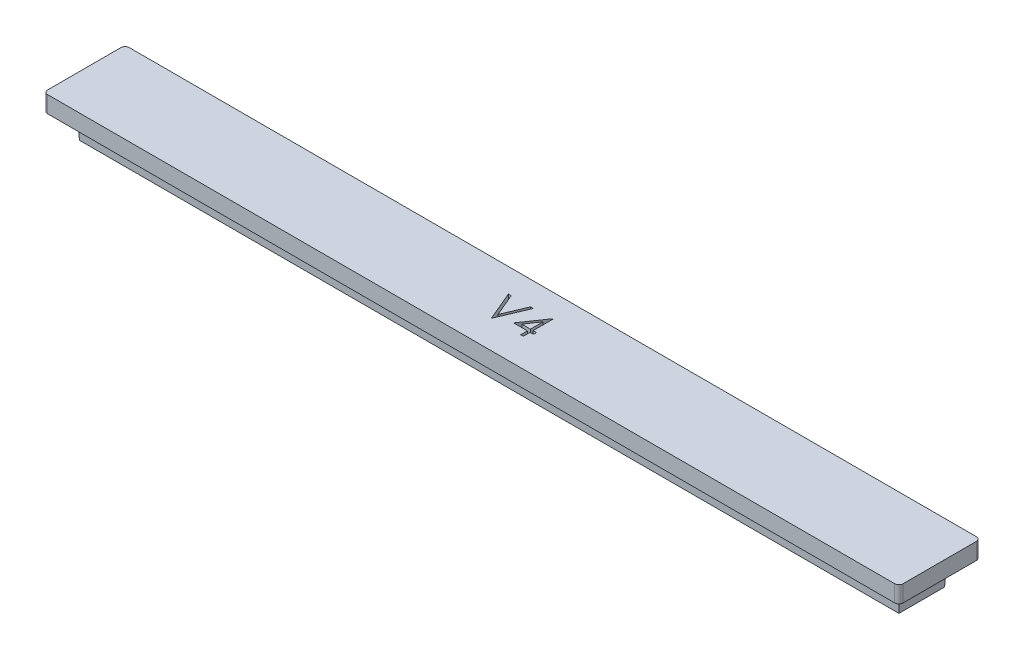
ISO-10303-21;
HEADER;
FILE_DESCRIPTION(('STEP AP214'),'2;1');
FILE_NAME('part.step','',(''),(''),'','','');
FILE_SCHEMA(('AUTOMOTIVE_DESIGN { 1 0 10303 214 1 1 1 1 }'));
ENDSEC;
DATA;
#1=APPLICATION_CONTEXT('core data for automotive mechanical design processes');
#2=APPLICATION_PROTOCOL_DEFINITION('international standard','automotive_design',2000,#1);
#3=PRODUCT_CONTEXT('',#1,'mechanical');
#4=PRODUCT('Part','Part','',(#3));
#5=PRODUCT_RELATED_PRODUCT_CATEGORY('part','',(#4));
#6=PRODUCT_DEFINITION_FORMATION('','',#4);
#7=PRODUCT_DEFINITION_CONTEXT('part definition',#1,'design');
#8=PRODUCT_DEFINITION('design','',#6,#7);
#9=PRODUCT_DEFINITION_SHAPE('','',#8);
#10=(LENGTH_UNIT() NAMED_UNIT(*) SI_UNIT(.MILLI.,.METRE.));
#11=(NAMED_UNIT(*) PLANE_ANGLE_UNIT() SI_UNIT($,.RADIAN.));
#12=(NAMED_UNIT(*) SI_UNIT($,.STERADIAN.) SOLID_ANGLE_UNIT());
#13=UNCERTAINTY_MEASURE_WITH_UNIT(LENGTH_MEASURE(1.E-05),#10,'distance_accuracy_value','');
#14=(GEOMETRIC_REPRESENTATION_CONTEXT(3) GLOBAL_UNCERTAINTY_ASSIGNED_CONTEXT((#13)) GLOBAL_UNIT_ASSIGNED_CONTEXT((#10,
#11,#12)) REPRESENTATION_CONTEXT('',''));
#15=CARTESIAN_POINT('',(0.,0.,0.));
#16=DIRECTION('',(0.,0.,1.));
#17=DIRECTION('',(1.,0.,0.));
#18=AXIS2_PLACEMENT_3D('',#15,#16,#17);
#19=CARTESIAN_POINT('',(0.,5.,0.));
#20=DIRECTION('',(0.,1.,0.));
#21=DIRECTION('',(0.,0.,1.));
#22=AXIS2_PLACEMENT_3D('',#19,#20,#21);
#23=PLANE('',#22);
#24=DIRECTION('',(-1.,0.,0.));
#25=VECTOR('',#24,1.);
#26=CARTESIAN_POINT('',(51.4,5.,-4.9));
#27=LINE('',#26,#25);
#28=CARTESIAN_POINT('',(50.9,5.,-4.9));
#29=VERTEX_POINT('',#28);
#30=CARTESIAN_POINT('',(-50.9,5.,-4.89999999999998));
#31=VERTEX_POINT('',#30);
#32=EDGE_CURVE('E426',#29,#31,#27,.T.);
#33=ORIENTED_EDGE('',*,*,#32,.T.);
#34=CARTESIAN_POINT('',(-50.9,5.,-4.39999999999998));
#35=DIRECTION('',(0.,1.,0.));
#36=DIRECTION('',(0.,0.,1.));
#37=AXIS2_PLACEMENT_3D('',#34,#35,#36);
#38=CIRCLE('',#37,0.5);
#39=CARTESIAN_POINT('',(-51.4,5.,-4.39999999999998));
#40=VERTEX_POINT('',#39);
#41=EDGE_CURVE('E509',#31,#40,#38,.T.);
#42=ORIENTED_EDGE('',*,*,#41,.T.);
#43=DIRECTION('',(0.,0.,1.));
#44=VECTOR('',#43,1.);
#45=CARTESIAN_POINT('',(-51.4,5.,-4.89999999999998));
#46=LINE('',#45,#44);
#47=CARTESIAN_POINT('',(-51.4,5.,4.4));
#48=VERTEX_POINT('',#47);
#49=EDGE_CURVE('E276',#40,#48,#46,.T.);
#50=ORIENTED_EDGE('',*,*,#49,.T.);
#51=CARTESIAN_POINT('',(-50.9,5.,4.4));
#52=DIRECTION('',(0.,1.,0.));
#53=DIRECTION('',(0.,0.,1.));
#54=AXIS2_PLACEMENT_3D('',#51,#52,#53);
#55=CIRCLE('',#54,0.5);
#56=CARTESIAN_POINT('',(-50.9,5.,4.9));
#57=VERTEX_POINT('',#56);
#58=EDGE_CURVE('E500',#48,#57,#55,.T.);
#59=ORIENTED_EDGE('',*,*,#58,.T.);
#60=DIRECTION('',(1.,0.,0.));
#61=VECTOR('',#60,1.);
#62=CARTESIAN_POINT('',(-51.4,5.,4.9));
#63=LINE('',#62,#61);
#64=CARTESIAN_POINT('',(50.9,5.,4.9));
#65=VERTEX_POINT('',#64);
#66=EDGE_CURVE('E282',#57,#65,#63,.T.);
#67=ORIENTED_EDGE('',*,*,#66,.T.);
#68=CARTESIAN_POINT('',(50.9,5.,4.4));
#69=DIRECTION('',(0.,1.,0.));
#70=DIRECTION('',(0.,0.,1.));
#71=AXIS2_PLACEMENT_3D('',#68,#69,#70);
#72=CIRCLE('',#71,0.5);
#73=CARTESIAN_POINT('',(51.4,5.,4.4));
#74=VERTEX_POINT('',#73);
#75=EDGE_CURVE('E503',#65,#74,#72,.T.);
#76=ORIENTED_EDGE('',*,*,#75,.T.);
#77=DIRECTION('',(0.,0.,-1.));
#78=VECTOR('',#77,1.);
#79=CARTESIAN_POINT('',(51.4,5.,4.9));
#80=LINE('',#79,#78);
#81=CARTESIAN_POINT('',(51.4,5.,-4.4));
#82=VERTEX_POINT('',#81);
#83=EDGE_CURVE('E442',#74,#82,#80,.T.);
#84=ORIENTED_EDGE('',*,*,#83,.T.);
#85=CARTESIAN_POINT('',(50.9,5.,-4.4));
#86=DIRECTION('',(0.,1.,0.));
#87=DIRECTION('',(0.,0.,1.));
#88=AXIS2_PLACEMENT_3D('',#85,#86,#87);
#89=CIRCLE('',#88,0.5);
#90=EDGE_CURVE('E506',#82,#29,#89,.T.);
#91=ORIENTED_EDGE('',*,*,#90,.T.);
#92=EDGE_LOOP('',(#33,#42,#50,#59,#67,#76,#84,#91));
#93=FACE_BOUND('',#92,.T.);
#94=DIRECTION('',(-1.,0.,0.));
#95=VECTOR('',#94,1.);
#96=CARTESIAN_POINT('',(2.51443006220043,5.,0.658238506771151));
#97=LINE('',#96,#95);
#98=CARTESIAN_POINT('',(2.51443006220043,5.,0.658238506771151));
#99=VERTEX_POINT('',#98);
#100=CARTESIAN_POINT('',(0.854173651944023,5.,0.658238506771151));
#101=VERTEX_POINT('',#100);
#102=EDGE_CURVE('E327',#99,#101,#97,.T.);
#103=ORIENTED_EDGE('',*,*,#102,.T.);
#104=DIRECTION('',(0.566105543193208,0.,-0.824332768950697));
#105=VECTOR('',#104,1.);
#106=CARTESIAN_POINT('',(0.854173651944023,5.,0.658238506771151));
#107=LINE('',#106,#105);
#108=CARTESIAN_POINT('',(2.76473054296966,5.,-2.12381277528013));
#109=VERTEX_POINT('',#108);
#110=EDGE_CURVE('E64',#101,#109,#107,.T.);
#111=ORIENTED_EDGE('',*,*,#110,.T.);
#112=DIRECTION('',(1.,0.,0.));
#113=VECTOR('',#112,1.);
#114=CARTESIAN_POINT('',(2.76473054296966,5.,-2.12381277528013));
#115=LINE('',#114,#113);
#116=CARTESIAN_POINT('',(2.828532626303,5.,-2.12381277528013));
#117=VERTEX_POINT('',#116);
#118=EDGE_CURVE('E357',#109,#117,#115,.T.);
#119=ORIENTED_EDGE('',*,*,#118,.T.);
#120=DIRECTION('',(0.,0.,1.));
#121=VECTOR('',#120,1.);
#122=CARTESIAN_POINT('',(2.828532626303,5.,-2.12381277528013));
#123=LINE('',#122,#121);
#124=CARTESIAN_POINT('',(2.828532626303,5.,0.299264147796792));
#125=VERTEX_POINT('',#124);
#126=EDGE_CURVE('E361',#117,#125,#123,.T.);
#127=ORIENTED_EDGE('',*,*,#126,.T.);
#128=DIRECTION('',(1.,0.,0.));
#129=VECTOR('',#128,1.);
#130=CARTESIAN_POINT('',(2.828532626303,5.,0.299264147796792));
#131=LINE('',#130,#129);
#132=CARTESIAN_POINT('',(3.23237878014915,5.,0.299264147796792));
#133=VERTEX_POINT('',#132);
#134=EDGE_CURVE('E365',#125,#133,#131,.T.);
#135=ORIENTED_EDGE('',*,*,#134,.T.);
#136=DIRECTION('',(0.,0.,1.));
#137=VECTOR('',#136,1.);
#138=CARTESIAN_POINT('',(3.23237878014915,5.,0.299264147796792));
#139=LINE('',#138,#137);
#140=CARTESIAN_POINT('',(3.23237878014915,5.,0.658238506771151));
#141=VERTEX_POINT('',#140);
#142=EDGE_CURVE('E369',#133,#141,#139,.T.);
#143=ORIENTED_EDGE('',*,*,#142,.T.);
#144=DIRECTION('',(-1.,0.,0.));
#145=VECTOR('',#144,1.);
#146=CARTESIAN_POINT('',(3.23237878014915,5.,0.658238506771151));
#147=LINE('',#146,#145);
#148=CARTESIAN_POINT('',(2.828532626303,5.,0.658238506771151));
#149=VERTEX_POINT('',#148);
#150=EDGE_CURVE('E373',#141,#149,#147,.T.);
#151=ORIENTED_EDGE('',*,*,#150,.T.);
#152=DIRECTION('',(0.,0.,1.));
#153=VECTOR('',#152,1.);
#154=CARTESIAN_POINT('',(2.828532626303,5.,0.658238506771151));
#155=LINE('',#154,#153);
#156=CARTESIAN_POINT('',(2.828532626303,5.,1.46593081446346));
#157=VERTEX_POINT('',#156);
#158=EDGE_CURVE('E377',#149,#157,#155,.T.);
#159=ORIENTED_EDGE('',*,*,#158,.T.);
#160=DIRECTION('',(-1.,0.,0.));
#161=VECTOR('',#160,1.);
#162=CARTESIAN_POINT('',(2.828532626303,5.,1.46593081446346));
#163=LINE('',#162,#161);
#164=CARTESIAN_POINT('',(2.51443006220043,5.,1.46593081446346));
#165=VERTEX_POINT('',#164);
#166=EDGE_CURVE('E381',#157,#165,#163,.T.);
#167=ORIENTED_EDGE('',*,*,#166,.T.);
#168=DIRECTION('',(0.,0.,-1.));
#169=VECTOR('',#168,1.);
#170=CARTESIAN_POINT('',(2.51443006220043,5.,1.46593081446346));
#171=LINE('',#170,#169);
#172=EDGE_CURVE('E385',#165,#99,#171,.T.);
#173=ORIENTED_EDGE('',*,*,#172,.T.);
#174=EDGE_LOOP('',(#103,#111,#119,#127,#135,#143,#151,#159,#167,#173));
#175=FACE_BOUND('',#174,.T.);
#176=DIRECTION('',(-1.,0.,0.));
#177=VECTOR('',#176,1.);
#178=CARTESIAN_POINT('',(-0.940698142927772,5.,1.46593081446346));
#179=LINE('',#178,#177);
#180=CARTESIAN_POINT('',(-0.940698142927772,5.,1.46593081446346));
#181=VERTEX_POINT('',#180);
#182=CARTESIAN_POINT('',(-0.985569937799566,5.,1.46593081446346));
#183=VERTEX_POINT('',#182);
#184=EDGE_CURVE('E270',#181,#183,#179,.T.);
#185=ORIENTED_EDGE('',*,*,#184,.T.);
#186=DIRECTION('',(-0.389639990836698,0.,-0.920967251068559));
#187=VECTOR('',#186,1.);
#188=CARTESIAN_POINT('',(-0.985569937799566,5.,1.46593081446346));
#189=LINE('',#188,#187);
#190=CARTESIAN_POINT('',(-2.4663391685688,5.,-2.03406918553654));
#191=VERTEX_POINT('',#190);
#192=EDGE_CURVE('E56',#183,#191,#189,.T.);
#193=ORIENTED_EDGE('',*,*,#192,.T.);
#194=DIRECTION('',(1.,0.,0.));
#195=VECTOR('',#194,1.);
#196=CARTESIAN_POINT('',(-2.4663391685688,5.,-2.03406918553654));
#197=LINE('',#196,#195);
#198=CARTESIAN_POINT('',(-2.12980070703034,5.,-2.03406918553654));
#199=VERTEX_POINT('',#198);
#200=EDGE_CURVE('E274',#191,#199,#197,.T.);
#201=ORIENTED_EDGE('',*,*,#200,.T.);
#202=DIRECTION('',(0.389563616454194,0.,0.920999559573798));
#203=VECTOR('',#202,1.);
#204=CARTESIAN_POINT('',(-2.12980070703034,5.,-2.03406918553654));
#205=LINE('',#204,#203);
#206=CARTESIAN_POINT('',(-0.963134040363669,5.,0.7241439554891));
#207=VERTEX_POINT('',#206);
#208=EDGE_CURVE('E921',#199,#207,#205,.T.);
#209=ORIENTED_EDGE('',*,*,#208,.T.);
#210=DIRECTION('',(0.389563616454194,0.,-0.920999559573798));
#211=VECTOR('',#210,1.);
#212=CARTESIAN_POINT('',(-0.963134040363669,5.,0.7241439554891));
#213=LINE('',#212,#211);
#214=CARTESIAN_POINT('',(0.203532626302998,5.,-2.03406918553654));
#215=VERTEX_POINT('',#214);
#216=EDGE_CURVE('E902',#207,#215,#213,.T.);
#217=ORIENTED_EDGE('',*,*,#216,.T.);
#218=DIRECTION('',(1.,0.,0.));
#219=VECTOR('',#218,1.);
#220=CARTESIAN_POINT('',(0.203532626302998,5.,-2.03406918553654));
#221=LINE('',#220,#219);
#222=CARTESIAN_POINT('',(0.540071087841459,5.,-2.03406918553654));
#223=VERTEX_POINT('',#222);
#224=EDGE_CURVE('E897',#215,#223,#221,.T.);
#225=ORIENTED_EDGE('',*,*,#224,.T.);
#226=DIRECTION('',(-0.389639990836698,0.,0.920967251068559));
#227=VECTOR('',#226,1.);
#228=CARTESIAN_POINT('',(0.540071087841459,5.,-2.03406918553654));
#229=LINE('',#228,#227);
#230=EDGE_CURVE('E891',#223,#181,#229,.T.);
#231=ORIENTED_EDGE('',*,*,#230,.T.);
#232=EDGE_LOOP('',(#185,#193,#201,#209,#217,#225,#231));
#233=FACE_BOUND('',#232,.T.);
#234=ADVANCED_FACE('F40',(#93,#175,#233),#23,.T.);
#235=CARTESIAN_POINT('',(49.4,3.,0.));
#236=DIRECTION('',(0.998629534754574,-0.0523359562429439,0.));
#237=DIRECTION('',(0.052335956242944,0.998629534754574,0.));
#238=AXIS2_PLACEMENT_3D('',#235,#236,#237);
#239=PLANE('',#238);
#240=DIRECTION('',(0.,0.,1.));
#241=VECTOR('',#240,1.);
#242=CARTESIAN_POINT('',(49.2427766621509,0.,0.));
#243=LINE('',#242,#241);
#244=CARTESIAN_POINT('',(49.2427766621509,0.,2.74277666215088));
#245=VERTEX_POINT('',#244);
#246=CARTESIAN_POINT('',(49.2427766621509,0.,-2.74277666215088));
#247=VERTEX_POINT('',#246);
#248=EDGE_CURVE('E437',#245,#247,#243,.F.);
#249=ORIENTED_EDGE('',*,*,#248,.T.);
#250=DIRECTION('',(-0.0522644276887141,-0.997264688634237,0.052264427688714));
#251=VECTOR('',#250,1.);
#252=CARTESIAN_POINT('',(49.2650604221595,0.425199470641776,-2.76506042215954));
#253=LINE('',#252,#251);
#254=CARTESIAN_POINT('',(49.4,3.,-2.9));
#255=VERTEX_POINT('',#254);
#256=EDGE_CURVE('E449',#255,#247,#253,.T.);
#257=ORIENTED_EDGE('',*,*,#256,.F.);
#258=DIRECTION('',(0.,0.,1.));
#259=VECTOR('',#258,1.);
#260=CARTESIAN_POINT('',(49.4,3.,0.));
#261=LINE('',#260,#259);
#262=CARTESIAN_POINT('',(49.4,3.,2.9));
#263=VERTEX_POINT('',#262);
#264=EDGE_CURVE('E474',#263,#255,#261,.F.);
#265=ORIENTED_EDGE('',*,*,#264,.F.);
#266=DIRECTION('',(-0.052264427688714,-0.997264688634237,-0.052264427688714));
#267=VECTOR('',#266,1.);
#268=CARTESIAN_POINT('',(49.3920784458353,2.84884774220367,2.89207844583528));
#269=LINE('',#268,#267);
#270=EDGE_CURVE('E455',#263,#245,#269,.T.);
#271=ORIENTED_EDGE('',*,*,#270,.T.);
#272=EDGE_LOOP('',(#249,#257,#265,#271));
#273=FACE_BOUND('',#272,.T.);
#274=ADVANCED_FACE('F585',(#273),#239,.T.);
#275=CARTESIAN_POINT('',(0.,3.,-2.9));
#276=DIRECTION('',(0.,-0.0523359562429439,-0.998629534754574));
#277=DIRECTION('',(0.,0.998629534754574,-0.052335956242944));
#278=AXIS2_PLACEMENT_3D('',#275,#276,#277);
#279=PLANE('',#278);
#280=DIRECTION('',(1.,0.,0.));
#281=VECTOR('',#280,1.);
#282=CARTESIAN_POINT('',(0.,0.,-2.74277666215088));
#283=LINE('',#282,#281);
#284=CARTESIAN_POINT('',(-49.2427766621509,0.,-2.74277666215088));
#285=VERTEX_POINT('',#284);
#286=EDGE_CURVE('E470',#247,#285,#283,.F.);
#287=ORIENTED_EDGE('',*,*,#286,.T.);
#288=DIRECTION('',(0.052264427688714,-0.997264688634237,0.052264427688714));
#289=VECTOR('',#288,1.);
#290=CARTESIAN_POINT('',(-49.3920784458353,2.84884774220367,-2.89207844583528));
#291=LINE('',#290,#289);
#292=CARTESIAN_POINT('',(-49.4,3.,-2.9));
#293=VERTEX_POINT('',#292);
#294=EDGE_CURVE('E454',#293,#285,#291,.T.);
#295=ORIENTED_EDGE('',*,*,#294,.F.);
#296=DIRECTION('',(1.,0.,0.));
#297=VECTOR('',#296,1.);
#298=CARTESIAN_POINT('',(0.,3.,-2.9));
#299=LINE('',#298,#297);
#300=EDGE_CURVE('E483',#255,#293,#299,.F.);
#301=ORIENTED_EDGE('',*,*,#300,.F.);
#302=ORIENTED_EDGE('',*,*,#256,.T.);
#303=EDGE_LOOP('',(#287,#295,#301,#302));
#304=FACE_BOUND('',#303,.T.);
#305=ADVANCED_FACE('F591',(#304),#279,.T.);
#306=CARTESIAN_POINT('',(-49.4,3.,0.));
#307=DIRECTION('',(-0.998629534754574,-0.0523359562429439,0.));
#308=DIRECTION('',(0.052335956242944,-0.998629534754574,0.));
#309=AXIS2_PLACEMENT_3D('',#306,#307,#308);
#310=PLANE('',#309);
#311=DIRECTION('',(0.,0.,-1.));
#312=VECTOR('',#311,1.);
#313=CARTESIAN_POINT('',(-49.2427766621509,0.,0.));
#314=LINE('',#313,#312);
#315=CARTESIAN_POINT('',(-49.2427766621509,0.,2.74277666215088));
#316=VERTEX_POINT('',#315);
#317=EDGE_CURVE('E475',#285,#316,#314,.F.);
#318=ORIENTED_EDGE('',*,*,#317,.T.);
#319=DIRECTION('',(0.0522644276887141,-0.997264688634237,-0.052264427688714));
#320=VECTOR('',#319,1.);
#321=CARTESIAN_POINT('',(-49.2650604221596,0.425199470641774,2.76506042215954));
#322=LINE('',#321,#320);
#323=CARTESIAN_POINT('',(-49.4,3.,2.9));
#324=VERTEX_POINT('',#323);
#325=EDGE_CURVE('E459',#324,#316,#322,.T.);
#326=ORIENTED_EDGE('',*,*,#325,.F.);
#327=DIRECTION('',(0.,0.,-1.));
#328=VECTOR('',#327,1.);
#329=CARTESIAN_POINT('',(-49.4,3.,0.));
#330=LINE('',#329,#328);
#331=EDGE_CURVE('E487',#293,#324,#330,.F.);
#332=ORIENTED_EDGE('',*,*,#331,.F.);
#333=ORIENTED_EDGE('',*,*,#294,.T.);
#334=EDGE_LOOP('',(#318,#326,#332,#333));
#335=FACE_BOUND('',#334,.T.);
#336=ADVANCED_FACE('F685',(#335),#310,.T.);
#337=CARTESIAN_POINT('',(0.,3.,2.9));
#338=DIRECTION('',(0.,-0.0523359562429439,0.998629534754574));
#339=DIRECTION('',(0.,-0.998629534754574,-0.052335956242944));
#340=AXIS2_PLACEMENT_3D('',#337,#338,#339);
#341=PLANE('',#340);
#342=DIRECTION('',(-1.,0.,0.));
#343=VECTOR('',#342,1.);
#344=CARTESIAN_POINT('',(0.,0.,2.74277666215088));
#345=LINE('',#344,#343);
#346=EDGE_CURVE('E471',#316,#245,#345,.F.);
#347=ORIENTED_EDGE('',*,*,#346,.T.);
#348=ORIENTED_EDGE('',*,*,#270,.F.);
#349=DIRECTION('',(-1.,0.,0.));
#350=VECTOR('',#349,1.);
#351=CARTESIAN_POINT('',(0.,3.,2.9));
#352=LINE('',#351,#350);
#353=EDGE_CURVE('E460',#324,#263,#352,.F.);
#354=ORIENTED_EDGE('',*,*,#353,.F.);
#355=ORIENTED_EDGE('',*,*,#325,.T.);
#356=EDGE_LOOP('',(#347,#348,#354,#355));
#357=FACE_BOUND('',#356,.T.);
#358=ADVANCED_FACE('F679',(#357),#341,.T.);
#359=CARTESIAN_POINT('',(0.,0.,0.));
#360=DIRECTION('',(0.,1.,0.));
#361=DIRECTION('',(0.,0.,1.));
#362=AXIS2_PLACEMENT_3D('',#359,#360,#361);
#363=PLANE('',#362);
#364=ORIENTED_EDGE('',*,*,#248,.F.);
#365=ORIENTED_EDGE('',*,*,#346,.F.);
#366=ORIENTED_EDGE('',*,*,#317,.F.);
#367=ORIENTED_EDGE('',*,*,#286,.F.);
#368=EDGE_LOOP('',(#364,#365,#366,#367));
#369=FACE_BOUND('',#368,.T.);
#370=ADVANCED_FACE('F674',(#369),#363,.F.);
#371=CARTESIAN_POINT('',(0.,3.,0.));
#372=DIRECTION('',(0.,1.,0.));
#373=DIRECTION('',(0.,0.,1.));
#374=AXIS2_PLACEMENT_3D('',#371,#372,#373);
#375=PLANE('',#374);
#376=ORIENTED_EDGE('',*,*,#353,.T.);
#377=ORIENTED_EDGE('',*,*,#264,.T.);
#378=ORIENTED_EDGE('',*,*,#300,.T.);
#379=ORIENTED_EDGE('',*,*,#331,.T.);
#380=EDGE_LOOP('',(#376,#377,#378,#379));
#381=FACE_BOUND('',#380,.T.);
#382=DIRECTION('',(0.,0.,1.));
#383=VECTOR('',#382,1.);
#384=CARTESIAN_POINT('',(-51.4,3.,-4.89999999999998));
#385=LINE('',#384,#383);
#386=CARTESIAN_POINT('',(-51.4,3.,-4.39999999999998));
#387=VERTEX_POINT('',#386);
#388=CARTESIAN_POINT('',(-51.4,3.,4.4));
#389=VERTEX_POINT('',#388);
#390=EDGE_CURVE('E421',#387,#389,#385,.T.);
#391=ORIENTED_EDGE('',*,*,#390,.F.);
#392=CARTESIAN_POINT('',(-50.9,3.,-4.39999999999998));
#393=DIRECTION('',(0.,1.,0.));
#394=DIRECTION('',(0.,0.,1.));
#395=AXIS2_PLACEMENT_3D('',#392,#393,#394);
#396=CIRCLE('',#395,0.5);
#397=CARTESIAN_POINT('',(-50.9,3.,-4.89999999999998));
#398=VERTEX_POINT('',#397);
#399=EDGE_CURVE('E528',#387,#398,#396,.F.);
#400=ORIENTED_EDGE('',*,*,#399,.T.);
#401=DIRECTION('',(-1.,0.,0.));
#402=VECTOR('',#401,1.);
#403=CARTESIAN_POINT('',(51.4,3.,-4.9));
#404=LINE('',#403,#402);
#405=CARTESIAN_POINT('',(50.9,3.,-4.9));
#406=VERTEX_POINT('',#405);
#407=EDGE_CURVE('E434',#406,#398,#404,.T.);
#408=ORIENTED_EDGE('',*,*,#407,.F.);
#409=CARTESIAN_POINT('',(50.9,3.,-4.4));
#410=DIRECTION('',(0.,1.,0.));
#411=DIRECTION('',(0.,0.,1.));
#412=AXIS2_PLACEMENT_3D('',#409,#410,#411);
#413=CIRCLE('',#412,0.5);
#414=CARTESIAN_POINT('',(51.4,3.,-4.4));
#415=VERTEX_POINT('',#414);
#416=EDGE_CURVE('E525',#406,#415,#413,.F.);
#417=ORIENTED_EDGE('',*,*,#416,.T.);
#418=DIRECTION('',(0.,0.,-1.));
#419=VECTOR('',#418,1.);
#420=CARTESIAN_POINT('',(51.4,3.,4.9));
#421=LINE('',#420,#419);
#422=CARTESIAN_POINT('',(51.4,3.,4.4));
#423=VERTEX_POINT('',#422);
#424=EDGE_CURVE('E430',#423,#415,#421,.T.);
#425=ORIENTED_EDGE('',*,*,#424,.F.);
#426=CARTESIAN_POINT('',(50.9,3.,4.4));
#427=DIRECTION('',(0.,1.,0.));
#428=DIRECTION('',(0.,0.,1.));
#429=AXIS2_PLACEMENT_3D('',#426,#427,#428);
#430=CIRCLE('',#429,0.5);
#431=CARTESIAN_POINT('',(50.9,3.,4.9));
#432=VERTEX_POINT('',#431);
#433=EDGE_CURVE('E522',#423,#432,#430,.F.);
#434=ORIENTED_EDGE('',*,*,#433,.T.);
#435=DIRECTION('',(1.,0.,0.));
#436=VECTOR('',#435,1.);
#437=CARTESIAN_POINT('',(-51.4,3.,4.9));
#438=LINE('',#437,#436);
#439=CARTESIAN_POINT('',(-50.9,3.,4.9));
#440=VERTEX_POINT('',#439);
#441=EDGE_CURVE('E425',#440,#432,#438,.T.);
#442=ORIENTED_EDGE('',*,*,#441,.F.);
#443=CARTESIAN_POINT('',(-50.9,3.,4.4));
#444=DIRECTION('',(0.,1.,0.));
#445=DIRECTION('',(0.,0.,1.));
#446=AXIS2_PLACEMENT_3D('',#443,#444,#445);
#447=CIRCLE('',#446,0.5);
#448=EDGE_CURVE('E519',#440,#389,#447,.F.);
#449=ORIENTED_EDGE('',*,*,#448,.T.);
#450=EDGE_LOOP('',(#391,#400,#408,#417,#425,#434,#442,#449));
#451=FACE_BOUND('',#450,.T.);
#452=ADVANCED_FACE('F548',(#381,#451),#375,.F.);
#453=CARTESIAN_POINT('',(-51.4,3.,-4.89999999999998));
#454=DIRECTION('',(-1.,0.,0.));
#455=DIRECTION('',(0.,0.,1.));
#456=AXIS2_PLACEMENT_3D('',#453,#454,#455);
#457=PLANE('',#456);
#458=ORIENTED_EDGE('',*,*,#49,.F.);
#459=DIRECTION('',(0.,1.,0.));
#460=VECTOR('',#459,1.);
#461=CARTESIAN_POINT('',(-51.4,3.,-4.39999999999998));
#462=LINE('',#461,#460);
#463=EDGE_CURVE('E516',#40,#387,#462,.F.);
#464=ORIENTED_EDGE('',*,*,#463,.T.);
#465=ORIENTED_EDGE('',*,*,#390,.T.);
#466=DIRECTION('',(0.,1.,0.));
#467=VECTOR('',#466,1.);
#468=CARTESIAN_POINT('',(-51.4,3.,4.4));
#469=LINE('',#468,#467);
#470=EDGE_CURVE('E512',#389,#48,#469,.T.);
#471=ORIENTED_EDGE('',*,*,#470,.T.);
#472=EDGE_LOOP('',(#458,#464,#465,#471));
#473=FACE_BOUND('',#472,.T.);
#474=ADVANCED_FACE('F554',(#473),#457,.T.);
#475=CARTESIAN_POINT('',(51.4,3.,-4.9));
#476=DIRECTION('',(0.,0.,-1.));
#477=DIRECTION('',(-1.,0.,0.));
#478=AXIS2_PLACEMENT_3D('',#475,#476,#477);
#479=PLANE('',#478);
#480=ORIENTED_EDGE('',*,*,#407,.T.);
#481=DIRECTION('',(0.,1.,0.));
#482=VECTOR('',#481,1.);
#483=CARTESIAN_POINT('',(-50.9,3.,-4.89999999999998));
#484=LINE('',#483,#482);
#485=EDGE_CURVE('E496',#398,#31,#484,.T.);
#486=ORIENTED_EDGE('',*,*,#485,.T.);
#487=ORIENTED_EDGE('',*,*,#32,.F.);
#488=DIRECTION('',(0.,1.,0.));
#489=VECTOR('',#488,1.);
#490=CARTESIAN_POINT('',(50.9,3.,-4.9));
#491=LINE('',#490,#489);
#492=EDGE_CURVE('E453',#29,#406,#491,.F.);
#493=ORIENTED_EDGE('',*,*,#492,.T.);
#494=EDGE_LOOP('',(#480,#486,#487,#493));
#495=FACE_BOUND('',#494,.T.);
#496=ADVANCED_FACE('F564',(#495),#479,.T.);
#497=CARTESIAN_POINT('',(51.4,3.,4.9));
#498=DIRECTION('',(1.,0.,0.));
#499=DIRECTION('',(0.,0.,-1.));
#500=AXIS2_PLACEMENT_3D('',#497,#498,#499);
#501=PLANE('',#500);
#502=ORIENTED_EDGE('',*,*,#424,.T.);
#503=DIRECTION('',(0.,1.,0.));
#504=VECTOR('',#503,1.);
#505=CARTESIAN_POINT('',(51.4,3.,-4.4));
#506=LINE('',#505,#504);
#507=EDGE_CURVE('E534',#415,#82,#506,.T.);
#508=ORIENTED_EDGE('',*,*,#507,.T.);
#509=ORIENTED_EDGE('',*,*,#83,.F.);
#510=DIRECTION('',(0.,1.,0.));
#511=VECTOR('',#510,1.);
#512=CARTESIAN_POINT('',(51.4,3.,4.4));
#513=LINE('',#512,#511);
#514=EDGE_CURVE('E531',#74,#423,#513,.F.);
#515=ORIENTED_EDGE('',*,*,#514,.T.);
#516=EDGE_LOOP('',(#502,#508,#509,#515));
#517=FACE_BOUND('',#516,.T.);
#518=ADVANCED_FACE('F573',(#517),#501,.T.);
#519=CARTESIAN_POINT('',(-51.4,3.,4.9));
#520=DIRECTION('',(0.,0.,1.));
#521=DIRECTION('',(1.,0.,0.));
#522=AXIS2_PLACEMENT_3D('',#519,#520,#521);
#523=PLANE('',#522);
#524=ORIENTED_EDGE('',*,*,#441,.T.);
#525=DIRECTION('',(0.,1.,0.));
#526=VECTOR('',#525,1.);
#527=CARTESIAN_POINT('',(50.9,3.,4.9));
#528=LINE('',#527,#526);
#529=EDGE_CURVE('E11',#432,#65,#528,.T.);
#530=ORIENTED_EDGE('',*,*,#529,.T.);
#531=ORIENTED_EDGE('',*,*,#66,.F.);
#532=DIRECTION('',(0.,1.,0.));
#533=VECTOR('',#532,1.);
#534=CARTESIAN_POINT('',(-50.9,3.,4.9));
#535=LINE('',#534,#533);
#536=EDGE_CURVE('E49',#57,#440,#535,.F.);
#537=ORIENTED_EDGE('',*,*,#536,.T.);
#538=EDGE_LOOP('',(#524,#530,#531,#537));
#539=FACE_BOUND('',#538,.T.);
#540=ADVANCED_FACE('F542',(#539),#523,.T.);
#541=CARTESIAN_POINT('',(-50.9,3.,-4.39999999999998));
#542=DIRECTION('',(0.,1.,0.));
#543=DIRECTION('',(0.,0.,1.));
#544=AXIS2_PLACEMENT_3D('',#541,#542,#543);
#545=CYLINDRICAL_SURFACE('',#544,0.5);
#546=ORIENTED_EDGE('',*,*,#399,.F.);
#547=ORIENTED_EDGE('',*,*,#463,.F.);
#548=ORIENTED_EDGE('',*,*,#41,.F.);
#549=ORIENTED_EDGE('',*,*,#485,.F.);
#550=EDGE_LOOP('',(#546,#547,#548,#549));
#551=FACE_BOUND('',#550,.T.);
#552=ADVANCED_FACE('F562',(#551),#545,.T.);
#553=CARTESIAN_POINT('',(50.9,3.,-4.4));
#554=DIRECTION('',(0.,1.,0.));
#555=DIRECTION('',(0.,0.,1.));
#556=AXIS2_PLACEMENT_3D('',#553,#554,#555);
#557=CYLINDRICAL_SURFACE('',#556,0.5);
#558=ORIENTED_EDGE('',*,*,#416,.F.);
#559=ORIENTED_EDGE('',*,*,#492,.F.);
#560=ORIENTED_EDGE('',*,*,#90,.F.);
#561=ORIENTED_EDGE('',*,*,#507,.F.);
#562=EDGE_LOOP('',(#558,#559,#560,#561));
#563=FACE_BOUND('',#562,.T.);
#564=ADVANCED_FACE('F570',(#563),#557,.T.);
#565=CARTESIAN_POINT('',(50.9,3.,4.4));
#566=DIRECTION('',(0.,1.,0.));
#567=DIRECTION('',(0.,0.,1.));
#568=AXIS2_PLACEMENT_3D('',#565,#566,#567);
#569=CYLINDRICAL_SURFACE('',#568,0.5);
#570=ORIENTED_EDGE('',*,*,#433,.F.);
#571=ORIENTED_EDGE('',*,*,#514,.F.);
#572=ORIENTED_EDGE('',*,*,#75,.F.);
#573=ORIENTED_EDGE('',*,*,#529,.F.);
#574=EDGE_LOOP('',(#570,#571,#572,#573));
#575=FACE_BOUND('',#574,.T.);
#576=ADVANCED_FACE('F576',(#575),#569,.T.);
#577=CARTESIAN_POINT('',(-50.9,3.,4.4));
#578=DIRECTION('',(0.,1.,0.));
#579=DIRECTION('',(0.,0.,1.));
#580=AXIS2_PLACEMENT_3D('',#577,#578,#579);
#581=CYLINDRICAL_SURFACE('',#580,0.5);
#582=ORIENTED_EDGE('',*,*,#448,.F.);
#583=ORIENTED_EDGE('',*,*,#536,.F.);
#584=ORIENTED_EDGE('',*,*,#58,.F.);
#585=ORIENTED_EDGE('',*,*,#470,.F.);
#586=EDGE_LOOP('',(#582,#583,#584,#585));
#587=FACE_BOUND('',#586,.T.);
#588=ADVANCED_FACE('F42',(#587),#581,.T.);
#589=CARTESIAN_POINT('',(0.854173651944023,4.,0.658238506771151));
#590=DIRECTION('',(0.824332768950697,0.,0.566105543193208));
#591=DIRECTION('',(0.566105543193208,0.,-0.824332768950697));
#592=AXIS2_PLACEMENT_3D('',#589,#590,#591);
#593=PLANE('',#592);
#594=ORIENTED_EDGE('',*,*,#110,.F.);
#595=DIRECTION('',(0.,1.,0.));
#596=VECTOR('',#595,1.);
#597=CARTESIAN_POINT('',(0.854173651944023,4.,0.658238506771151));
#598=LINE('',#597,#596);
#599=CARTESIAN_POINT('',(0.854173651944023,4.,0.658238506771151));
#600=VERTEX_POINT('',#599);
#601=EDGE_CURVE('E354',#600,#101,#598,.T.);
#602=ORIENTED_EDGE('',*,*,#601,.F.);
#603=DIRECTION('',(0.566105543193208,0.,-0.824332768950697));
#604=VECTOR('',#603,1.);
#605=CARTESIAN_POINT('',(0.854173651944023,4.,0.658238506771151));
#606=LINE('',#605,#604);
#607=CARTESIAN_POINT('',(2.76473054296966,4.,-2.12381277528013));
#608=VERTEX_POINT('',#607);
#609=EDGE_CURVE('E322',#600,#608,#606,.T.);
#610=ORIENTED_EDGE('',*,*,#609,.T.);
#611=DIRECTION('',(0.,1.,0.));
#612=VECTOR('',#611,1.);
#613=CARTESIAN_POINT('',(2.76473054296966,4.,-2.12381277528013));
#614=LINE('',#613,#612);
#615=EDGE_CURVE('E418',#608,#109,#614,.T.);
#616=ORIENTED_EDGE('',*,*,#615,.T.);
#617=EDGE_LOOP('',(#594,#602,#610,#616));
#618=FACE_BOUND('',#617,.T.);
#619=ADVANCED_FACE('F582',(#618),#593,.T.);
#620=CARTESIAN_POINT('',(2.76473054296966,4.,-2.12381277528013));
#621=DIRECTION('',(0.,0.,1.));
#622=DIRECTION('',(1.,0.,0.));
#623=AXIS2_PLACEMENT_3D('',#620,#621,#622);
#624=PLANE('',#623);
#625=ORIENTED_EDGE('',*,*,#118,.F.);
#626=ORIENTED_EDGE('',*,*,#615,.F.);
#627=DIRECTION('',(1.,0.,0.));
#628=VECTOR('',#627,1.);
#629=CARTESIAN_POINT('',(2.76473054296966,4.,-2.12381277528013));
#630=LINE('',#629,#628);
#631=CARTESIAN_POINT('',(2.828532626303,4.,-2.12381277528013));
#632=VERTEX_POINT('',#631);
#633=EDGE_CURVE('E326',#608,#632,#630,.T.);
#634=ORIENTED_EDGE('',*,*,#633,.T.);
#635=DIRECTION('',(0.,1.,0.));
#636=VECTOR('',#635,1.);
#637=CARTESIAN_POINT('',(2.828532626303,4.,-2.12381277528013));
#638=LINE('',#637,#636);
#639=EDGE_CURVE('E415',#632,#117,#638,.T.);
#640=ORIENTED_EDGE('',*,*,#639,.T.);
#641=EDGE_LOOP('',(#625,#626,#634,#640));
#642=FACE_BOUND('',#641,.T.);
#643=ADVANCED_FACE('F658',(#642),#624,.T.);
#644=CARTESIAN_POINT('',(2.828532626303,4.,-2.12381277528013));
#645=DIRECTION('',(-1.,0.,0.));
#646=DIRECTION('',(0.,0.,1.));
#647=AXIS2_PLACEMENT_3D('',#644,#645,#646);
#648=PLANE('',#647);
#649=ORIENTED_EDGE('',*,*,#126,.F.);
#650=ORIENTED_EDGE('',*,*,#639,.F.);
#651=DIRECTION('',(0.,0.,1.));
#652=VECTOR('',#651,1.);
#653=CARTESIAN_POINT('',(2.828532626303,4.,-2.12381277528013));
#654=LINE('',#653,#652);
#655=CARTESIAN_POINT('',(2.828532626303,4.,0.299264147796792));
#656=VERTEX_POINT('',#655);
#657=EDGE_CURVE('E330',#632,#656,#654,.T.);
#658=ORIENTED_EDGE('',*,*,#657,.T.);
#659=DIRECTION('',(0.,1.,0.));
#660=VECTOR('',#659,1.);
#661=CARTESIAN_POINT('',(2.828532626303,4.,0.299264147796792));
#662=LINE('',#661,#660);
#663=EDGE_CURVE('E412',#656,#125,#662,.T.);
#664=ORIENTED_EDGE('',*,*,#663,.T.);
#665=EDGE_LOOP('',(#649,#650,#658,#664));
#666=FACE_BOUND('',#665,.T.);
#667=ADVANCED_FACE('F654',(#666),#648,.T.);
#668=CARTESIAN_POINT('',(2.828532626303,4.,0.299264147796792));
#669=DIRECTION('',(0.,0.,1.));
#670=DIRECTION('',(1.,0.,0.));
#671=AXIS2_PLACEMENT_3D('',#668,#669,#670);
#672=PLANE('',#671);
#673=ORIENTED_EDGE('',*,*,#134,.F.);
#674=ORIENTED_EDGE('',*,*,#663,.F.);
#675=DIRECTION('',(1.,0.,0.));
#676=VECTOR('',#675,1.);
#677=CARTESIAN_POINT('',(2.828532626303,4.,0.299264147796792));
#678=LINE('',#677,#676);
#679=CARTESIAN_POINT('',(3.23237878014915,4.,0.299264147796792));
#680=VERTEX_POINT('',#679);
#681=EDGE_CURVE('E333',#656,#680,#678,.T.);
#682=ORIENTED_EDGE('',*,*,#681,.T.);
#683=DIRECTION('',(0.,1.,0.));
#684=VECTOR('',#683,1.);
#685=CARTESIAN_POINT('',(3.23237878014915,4.,0.299264147796792));
#686=LINE('',#685,#684);
#687=EDGE_CURVE('E409',#680,#133,#686,.T.);
#688=ORIENTED_EDGE('',*,*,#687,.T.);
#689=EDGE_LOOP('',(#673,#674,#682,#688));
#690=FACE_BOUND('',#689,.T.);
#691=ADVANCED_FACE('F650',(#690),#672,.T.);
#692=CARTESIAN_POINT('',(3.23237878014915,4.,0.299264147796792));
#693=DIRECTION('',(-1.,0.,0.));
#694=DIRECTION('',(0.,0.,1.));
#695=AXIS2_PLACEMENT_3D('',#692,#693,#694);
#696=PLANE('',#695);
#697=ORIENTED_EDGE('',*,*,#142,.F.);
#698=ORIENTED_EDGE('',*,*,#687,.F.);
#699=DIRECTION('',(0.,0.,1.));
#700=VECTOR('',#699,1.);
#701=CARTESIAN_POINT('',(3.23237878014915,4.,0.299264147796792));
#702=LINE('',#701,#700);
#703=CARTESIAN_POINT('',(3.23237878014915,4.,0.658238506771151));
#704=VERTEX_POINT('',#703);
#705=EDGE_CURVE('E336',#680,#704,#702,.T.);
#706=ORIENTED_EDGE('',*,*,#705,.T.);
#707=DIRECTION('',(0.,1.,0.));
#708=VECTOR('',#707,1.);
#709=CARTESIAN_POINT('',(3.23237878014915,4.,0.658238506771151));
#710=LINE('',#709,#708);
#711=EDGE_CURVE('E406',#704,#141,#710,.T.);
#712=ORIENTED_EDGE('',*,*,#711,.T.);
#713=EDGE_LOOP('',(#697,#698,#706,#712));
#714=FACE_BOUND('',#713,.T.);
#715=ADVANCED_FACE('F646',(#714),#696,.T.);
#716=CARTESIAN_POINT('',(3.23237878014915,4.,0.658238506771151));
#717=DIRECTION('',(0.,0.,-1.));
#718=DIRECTION('',(-1.,0.,0.));
#719=AXIS2_PLACEMENT_3D('',#716,#717,#718);
#720=PLANE('',#719);
#721=ORIENTED_EDGE('',*,*,#150,.F.);
#722=ORIENTED_EDGE('',*,*,#711,.F.);
#723=DIRECTION('',(-1.,0.,0.));
#724=VECTOR('',#723,1.);
#725=CARTESIAN_POINT('',(3.23237878014915,4.,0.658238506771151));
#726=LINE('',#725,#724);
#727=CARTESIAN_POINT('',(2.828532626303,4.,0.658238506771151));
#728=VERTEX_POINT('',#727);
#729=EDGE_CURVE('E339',#704,#728,#726,.T.);
#730=ORIENTED_EDGE('',*,*,#729,.T.);
#731=DIRECTION('',(0.,1.,0.));
#732=VECTOR('',#731,1.);
#733=CARTESIAN_POINT('',(2.828532626303,4.,0.658238506771151));
#734=LINE('',#733,#732);
#735=EDGE_CURVE('E403',#728,#149,#734,.T.);
#736=ORIENTED_EDGE('',*,*,#735,.T.);
#737=EDGE_LOOP('',(#721,#722,#730,#736));
#738=FACE_BOUND('',#737,.T.);
#739=ADVANCED_FACE('F642',(#738),#720,.T.);
#740=CARTESIAN_POINT('',(2.828532626303,4.,0.658238506771151));
#741=DIRECTION('',(-1.,0.,0.));
#742=DIRECTION('',(0.,0.,1.));
#743=AXIS2_PLACEMENT_3D('',#740,#741,#742);
#744=PLANE('',#743);
#745=ORIENTED_EDGE('',*,*,#158,.F.);
#746=ORIENTED_EDGE('',*,*,#735,.F.);
#747=DIRECTION('',(0.,0.,1.));
#748=VECTOR('',#747,1.);
#749=CARTESIAN_POINT('',(2.828532626303,4.,0.658238506771151));
#750=LINE('',#749,#748);
#751=CARTESIAN_POINT('',(2.828532626303,4.,1.46593081446346));
#752=VERTEX_POINT('',#751);
#753=EDGE_CURVE('E342',#728,#752,#750,.T.);
#754=ORIENTED_EDGE('',*,*,#753,.T.);
#755=DIRECTION('',(0.,1.,0.));
#756=VECTOR('',#755,1.);
#757=CARTESIAN_POINT('',(2.828532626303,4.,1.46593081446346));
#758=LINE('',#757,#756);
#759=EDGE_CURVE('E400',#752,#157,#758,.T.);
#760=ORIENTED_EDGE('',*,*,#759,.T.);
#761=EDGE_LOOP('',(#745,#746,#754,#760));
#762=FACE_BOUND('',#761,.T.);
#763=ADVANCED_FACE('F638',(#762),#744,.T.);
#764=CARTESIAN_POINT('',(2.828532626303,4.,1.46593081446346));
#765=DIRECTION('',(0.,0.,-1.));
#766=DIRECTION('',(-1.,0.,0.));
#767=AXIS2_PLACEMENT_3D('',#764,#765,#766);
#768=PLANE('',#767);
#769=ORIENTED_EDGE('',*,*,#166,.F.);
#770=ORIENTED_EDGE('',*,*,#759,.F.);
#771=DIRECTION('',(-1.,0.,0.));
#772=VECTOR('',#771,1.);
#773=CARTESIAN_POINT('',(2.828532626303,4.,1.46593081446346));
#774=LINE('',#773,#772);
#775=CARTESIAN_POINT('',(2.51443006220043,4.,1.46593081446346));
#776=VERTEX_POINT('',#775);
#777=EDGE_CURVE('E345',#752,#776,#774,.T.);
#778=ORIENTED_EDGE('',*,*,#777,.T.);
#779=DIRECTION('',(0.,1.,0.));
#780=VECTOR('',#779,1.);
#781=CARTESIAN_POINT('',(2.51443006220043,4.,1.46593081446346));
#782=LINE('',#781,#780);
#783=EDGE_CURVE('E397',#776,#165,#782,.T.);
#784=ORIENTED_EDGE('',*,*,#783,.T.);
#785=EDGE_LOOP('',(#769,#770,#778,#784));
#786=FACE_BOUND('',#785,.T.);
#787=ADVANCED_FACE('F634',(#786),#768,.T.);
#788=CARTESIAN_POINT('',(2.51443006220043,4.,1.46593081446346));
#789=DIRECTION('',(1.,0.,0.));
#790=DIRECTION('',(0.,0.,-1.));
#791=AXIS2_PLACEMENT_3D('',#788,#789,#790);
#792=PLANE('',#791);
#793=ORIENTED_EDGE('',*,*,#172,.F.);
#794=ORIENTED_EDGE('',*,*,#783,.F.);
#795=DIRECTION('',(0.,0.,-1.));
#796=VECTOR('',#795,1.);
#797=CARTESIAN_POINT('',(2.51443006220043,4.,1.46593081446346));
#798=LINE('',#797,#796);
#799=CARTESIAN_POINT('',(2.51443006220043,4.,0.658238506771151));
#800=VERTEX_POINT('',#799);
#801=EDGE_CURVE('E348',#776,#800,#798,.T.);
#802=ORIENTED_EDGE('',*,*,#801,.T.);
#803=DIRECTION('',(0.,1.,0.));
#804=VECTOR('',#803,1.);
#805=CARTESIAN_POINT('',(2.51443006220043,4.,0.658238506771151));
#806=LINE('',#805,#804);
#807=EDGE_CURVE('E394',#800,#99,#806,.T.);
#808=ORIENTED_EDGE('',*,*,#807,.T.);
#809=EDGE_LOOP('',(#793,#794,#802,#808));
#810=FACE_BOUND('',#809,.T.);
#811=ADVANCED_FACE('F630',(#810),#792,.T.);
#812=CARTESIAN_POINT('',(2.51443006220043,4.,0.658238506771151));
#813=DIRECTION('',(0.,0.,-1.));
#814=DIRECTION('',(-1.,0.,0.));
#815=AXIS2_PLACEMENT_3D('',#812,#813,#814);
#816=PLANE('',#815);
#817=ORIENTED_EDGE('',*,*,#102,.F.);
#818=ORIENTED_EDGE('',*,*,#807,.F.);
#819=DIRECTION('',(-1.,0.,0.));
#820=VECTOR('',#819,1.);
#821=CARTESIAN_POINT('',(2.51443006220043,4.,0.658238506771151));
#822=LINE('',#821,#820);
#823=EDGE_CURVE('E351',#800,#600,#822,.T.);
#824=ORIENTED_EDGE('',*,*,#823,.T.);
#825=ORIENTED_EDGE('',*,*,#601,.T.);
#826=EDGE_LOOP('',(#817,#818,#824,#825));
#827=FACE_BOUND('',#826,.T.);
#828=ADVANCED_FACE('F624',(#827),#816,.T.);
#829=CARTESIAN_POINT('',(0.,4.,0.));
#830=DIRECTION('',(0.,-1.,0.));
#831=DIRECTION('',(0.,0.,-1.));
#832=AXIS2_PLACEMENT_3D('',#829,#830,#831);
#833=PLANE('',#832);
#834=DIRECTION('',(1.,0.,0.));
#835=VECTOR('',#834,1.);
#836=CARTESIAN_POINT('',(1.4711608314312,4.,0.299264147796792));
#837=LINE('',#836,#835);
#838=CARTESIAN_POINT('',(1.4711608314312,4.,0.299264147796792));
#839=VERTEX_POINT('',#838);
#840=CARTESIAN_POINT('',(2.51443006220043,4.,0.299264147796792));
#841=VERTEX_POINT('',#840);
#842=EDGE_CURVE('E288',#839,#841,#837,.T.);
#843=ORIENTED_EDGE('',*,*,#842,.F.);
#844=DIRECTION('',(-0.565883050718714,0.,0.82448552013318));
#845=VECTOR('',#844,1.);
#846=CARTESIAN_POINT('',(2.51443006220043,4.,-1.22076790348526));
#847=LINE('',#846,#845);
#848=CARTESIAN_POINT('',(2.51443006220043,4.,-1.22076790348526));
#849=VERTEX_POINT('',#848);
#850=EDGE_CURVE('E297',#849,#839,#847,.T.);
#851=ORIENTED_EDGE('',*,*,#850,.F.);
#852=DIRECTION('',(0.,0.,-1.));
#853=VECTOR('',#852,1.);
#854=CARTESIAN_POINT('',(2.51443006220043,4.,0.299264147796792));
#855=LINE('',#854,#853);
#856=EDGE_CURVE('E292',#841,#849,#855,.T.);
#857=ORIENTED_EDGE('',*,*,#856,.F.);
#858=EDGE_LOOP('',(#843,#851,#857));
#859=FACE_BOUND('',#858,.T.);
#860=ORIENTED_EDGE('',*,*,#609,.F.);
#861=ORIENTED_EDGE('',*,*,#823,.F.);
#862=ORIENTED_EDGE('',*,*,#801,.F.);
#863=ORIENTED_EDGE('',*,*,#777,.F.);
#864=ORIENTED_EDGE('',*,*,#753,.F.);
#865=ORIENTED_EDGE('',*,*,#729,.F.);
#866=ORIENTED_EDGE('',*,*,#705,.F.);
#867=ORIENTED_EDGE('',*,*,#681,.F.);
#868=ORIENTED_EDGE('',*,*,#657,.F.);
#869=ORIENTED_EDGE('',*,*,#633,.F.);
#870=EDGE_LOOP('',(#860,#861,#862,#863,#864,#865,#866,#867,#868,#869));
#871=FACE_BOUND('',#870,.T.);
#872=ADVANCED_FACE('F613',(#859,#871),#833,.F.);
#873=CARTESIAN_POINT('',(1.4711608314312,4.,0.299264147796792));
#874=DIRECTION('',(0.,0.,1.));
#875=DIRECTION('',(1.,0.,0.));
#876=AXIS2_PLACEMENT_3D('',#873,#874,#875);
#877=PLANE('',#876);
#878=DIRECTION('',(1.,0.,0.));
#879=VECTOR('',#878,1.);
#880=CARTESIAN_POINT('',(1.4711608314312,5.,0.299264147796792));
#881=LINE('',#880,#879);
#882=CARTESIAN_POINT('',(1.4711608314312,5.,0.299264147796792));
#883=VERTEX_POINT('',#882);
#884=CARTESIAN_POINT('',(2.51443006220043,5.,0.299264147796792));
#885=VERTEX_POINT('',#884);
#886=EDGE_CURVE('E302',#883,#885,#881,.T.);
#887=ORIENTED_EDGE('',*,*,#886,.F.);
#888=DIRECTION('',(0.,1.,0.));
#889=VECTOR('',#888,1.);
#890=CARTESIAN_POINT('',(1.4711608314312,4.,0.299264147796792));
#891=LINE('',#890,#889);
#892=EDGE_CURVE('E313',#839,#883,#891,.T.);
#893=ORIENTED_EDGE('',*,*,#892,.F.);
#894=ORIENTED_EDGE('',*,*,#842,.T.);
#895=DIRECTION('',(0.,1.,0.));
#896=VECTOR('',#895,1.);
#897=CARTESIAN_POINT('',(2.51443006220043,4.,0.299264147796792));
#898=LINE('',#897,#896);
#899=EDGE_CURVE('E301',#841,#885,#898,.T.);
#900=ORIENTED_EDGE('',*,*,#899,.T.);
#901=EDGE_LOOP('',(#887,#893,#894,#900));
#902=FACE_BOUND('',#901,.T.);
#903=ADVANCED_FACE('F616',(#902),#877,.T.);
#904=CARTESIAN_POINT('',(2.51443006220043,4.,-1.22076790348526));
#905=DIRECTION('',(-0.82448552013318,0.,-0.565883050718714));
#906=DIRECTION('',(-0.565883050718714,0.,0.82448552013318));
#907=AXIS2_PLACEMENT_3D('',#904,#905,#906);
#908=PLANE('',#907);
#909=DIRECTION('',(-0.565883050718714,0.,0.82448552013318));
#910=VECTOR('',#909,1.);
#911=CARTESIAN_POINT('',(2.51443006220043,5.,-1.22076790348526));
#912=LINE('',#911,#910);
#913=CARTESIAN_POINT('',(2.51443006220043,5.,-1.22076790348526));
#914=VERTEX_POINT('',#913);
#915=EDGE_CURVE('E293',#914,#883,#912,.T.);
#916=ORIENTED_EDGE('',*,*,#915,.F.);
#917=DIRECTION('',(0.,1.,0.));
#918=VECTOR('',#917,1.);
#919=CARTESIAN_POINT('',(2.51443006220043,4.,-1.22076790348526));
#920=LINE('',#919,#918);
#921=EDGE_CURVE('E316',#849,#914,#920,.T.);
#922=ORIENTED_EDGE('',*,*,#921,.F.);
#923=ORIENTED_EDGE('',*,*,#850,.T.);
#924=ORIENTED_EDGE('',*,*,#892,.T.);
#925=EDGE_LOOP('',(#916,#922,#923,#924));
#926=FACE_BOUND('',#925,.T.);
#927=ADVANCED_FACE('F607',(#926),#908,.T.);
#928=CARTESIAN_POINT('',(2.51443006220043,4.,0.299264147796792));
#929=DIRECTION('',(1.,0.,0.));
#930=DIRECTION('',(0.,0.,-1.));
#931=AXIS2_PLACEMENT_3D('',#928,#929,#930);
#932=PLANE('',#931);
#933=DIRECTION('',(0.,0.,-1.));
#934=VECTOR('',#933,1.);
#935=CARTESIAN_POINT('',(2.51443006220043,5.,0.299264147796792));
#936=LINE('',#935,#934);
#937=EDGE_CURVE('E306',#885,#914,#936,.T.);
#938=ORIENTED_EDGE('',*,*,#937,.F.);
#939=ORIENTED_EDGE('',*,*,#899,.F.);
#940=ORIENTED_EDGE('',*,*,#856,.T.);
#941=ORIENTED_EDGE('',*,*,#921,.T.);
#942=EDGE_LOOP('',(#938,#939,#940,#941));
#943=FACE_BOUND('',#942,.T.);
#944=ADVANCED_FACE('F609',(#943),#932,.T.);
#945=CARTESIAN_POINT('',(-0.985569937799566,4.,1.46593081446346));
#946=DIRECTION('',(0.920967251068559,0.,-0.389639990836698));
#947=DIRECTION('',(-0.389639990836698,0.,-0.920967251068559));
#948=AXIS2_PLACEMENT_3D('',#945,#946,#947);
#949=PLANE('',#948);
#950=ORIENTED_EDGE('',*,*,#192,.F.);
#951=DIRECTION('',(0.,1.,0.));
#952=VECTOR('',#951,1.);
#953=CARTESIAN_POINT('',(-0.985569937799566,4.,1.46593081446346));
#954=LINE('',#953,#952);
#955=CARTESIAN_POINT('',(-0.985569937799566,4.,1.46593081446346));
#956=VERTEX_POINT('',#955);
#957=EDGE_CURVE('E268',#956,#183,#954,.T.);
#958=ORIENTED_EDGE('',*,*,#957,.F.);
#959=DIRECTION('',(-0.389639990836698,0.,-0.920967251068559));
#960=VECTOR('',#959,1.);
#961=CARTESIAN_POINT('',(-0.985569937799566,4.,1.46593081446346));
#962=LINE('',#961,#960);
#963=CARTESIAN_POINT('',(-2.4663391685688,4.,-2.03406918553654));
#964=VERTEX_POINT('',#963);
#965=EDGE_CURVE('E258',#956,#964,#962,.T.);
#966=ORIENTED_EDGE('',*,*,#965,.T.);
#967=DIRECTION('',(0.,1.,0.));
#968=VECTOR('',#967,1.);
#969=CARTESIAN_POINT('',(-2.4663391685688,4.,-2.03406918553654));
#970=LINE('',#969,#968);
#971=EDGE_CURVE('E267',#964,#191,#970,.T.);
#972=ORIENTED_EDGE('',*,*,#971,.T.);
#973=EDGE_LOOP('',(#950,#958,#966,#972));
#974=FACE_BOUND('',#973,.T.);
#975=ADVANCED_FACE('F266',(#974),#949,.T.);
#976=CARTESIAN_POINT('',(-2.4663391685688,4.,-2.03406918553654));
#977=DIRECTION('',(0.,0.,1.));
#978=DIRECTION('',(1.,0.,0.));
#979=AXIS2_PLACEMENT_3D('',#976,#977,#978);
#980=PLANE('',#979);
#981=ORIENTED_EDGE('',*,*,#200,.F.);
#982=ORIENTED_EDGE('',*,*,#971,.F.);
#983=DIRECTION('',(1.,0.,0.));
#984=VECTOR('',#983,1.);
#985=CARTESIAN_POINT('',(-2.4663391685688,4.,-2.03406918553654));
#986=LINE('',#985,#984);
#987=CARTESIAN_POINT('',(-2.12980070703034,4.,-2.03406918553654));
#988=VERTEX_POINT('',#987);
#989=EDGE_CURVE('E254',#964,#988,#986,.T.);
#990=ORIENTED_EDGE('',*,*,#989,.T.);
#991=DIRECTION('',(0.,1.,0.));
#992=VECTOR('',#991,1.);
#993=CARTESIAN_POINT('',(-2.12980070703034,4.,-2.03406918553654));
#994=LINE('',#993,#992);
#995=EDGE_CURVE('E277',#988,#199,#994,.T.);
#996=ORIENTED_EDGE('',*,*,#995,.T.);
#997=EDGE_LOOP('',(#981,#982,#990,#996));
#998=FACE_BOUND('',#997,.T.);
#999=ADVANCED_FACE('F272',(#998),#980,.T.);
#1000=CARTESIAN_POINT('',(-2.12980070703034,4.,-2.03406918553654));
#1001=DIRECTION('',(-0.920999559573798,0.,0.389563616454194));
#1002=DIRECTION('',(0.389563616454194,0.,0.920999559573798));
#1003=AXIS2_PLACEMENT_3D('',#1000,#1001,#1002);
#1004=PLANE('',#1003);
#1005=ORIENTED_EDGE('',*,*,#208,.F.);
#1006=ORIENTED_EDGE('',*,*,#995,.F.);
#1007=DIRECTION('',(0.389563616454194,0.,0.920999559573798));
#1008=VECTOR('',#1007,1.);
#1009=CARTESIAN_POINT('',(-2.12980070703034,4.,-2.03406918553654));
#1010=LINE('',#1009,#1008);
#1011=CARTESIAN_POINT('',(-0.963134040363669,4.,0.7241439554891));
#1012=VERTEX_POINT('',#1011);
#1013=EDGE_CURVE('E260',#988,#1012,#1010,.T.);
#1014=ORIENTED_EDGE('',*,*,#1013,.T.);
#1015=DIRECTION('',(0.,1.,0.));
#1016=VECTOR('',#1015,1.);
#1017=CARTESIAN_POINT('',(-0.963134040363669,4.,0.7241439554891));
#1018=LINE('',#1017,#1016);
#1019=EDGE_CURVE('E284',#1012,#207,#1018,.T.);
#1020=ORIENTED_EDGE('',*,*,#1019,.T.);
#1021=EDGE_LOOP('',(#1005,#1006,#1014,#1020));
#1022=FACE_BOUND('',#1021,.T.);
#1023=ADVANCED_FACE('F818',(#1022),#1004,.T.);
#1024=CARTESIAN_POINT('',(-0.963134040363669,4.,0.7241439554891));
#1025=DIRECTION('',(0.920999559573798,0.,0.389563616454194));
#1026=DIRECTION('',(0.389563616454194,0.,-0.920999559573798));
#1027=AXIS2_PLACEMENT_3D('',#1024,#1025,#1026);
#1028=PLANE('',#1027);
#1029=ORIENTED_EDGE('',*,*,#216,.F.);
#1030=ORIENTED_EDGE('',*,*,#1019,.F.);
#1031=DIRECTION('',(0.389563616454194,0.,-0.920999559573798));
#1032=VECTOR('',#1031,1.);
#1033=CARTESIAN_POINT('',(-0.963134040363669,4.,0.7241439554891));
#1034=LINE('',#1033,#1032);
#1035=CARTESIAN_POINT('',(0.203532626302998,4.,-2.03406918553654));
#1036=VERTEX_POINT('',#1035);
#1037=EDGE_CURVE('E939',#1012,#1036,#1034,.T.);
#1038=ORIENTED_EDGE('',*,*,#1037,.T.);
#1039=DIRECTION('',(0.,1.,0.));
#1040=VECTOR('',#1039,1.);
#1041=CARTESIAN_POINT('',(0.203532626302998,4.,-2.03406918553654));
#1042=LINE('',#1041,#1040);
#1043=EDGE_CURVE('E914',#1036,#215,#1042,.T.);
#1044=ORIENTED_EDGE('',*,*,#1043,.T.);
#1045=EDGE_LOOP('',(#1029,#1030,#1038,#1044));
#1046=FACE_BOUND('',#1045,.T.);
#1047=ADVANCED_FACE('F827',(#1046),#1028,.T.);
#1048=CARTESIAN_POINT('',(0.203532626302998,4.,-2.03406918553654));
#1049=DIRECTION('',(0.,0.,1.));
#1050=DIRECTION('',(1.,0.,0.));
#1051=AXIS2_PLACEMENT_3D('',#1048,#1049,#1050);
#1052=PLANE('',#1051);
#1053=ORIENTED_EDGE('',*,*,#224,.F.);
#1054=ORIENTED_EDGE('',*,*,#1043,.F.);
#1055=DIRECTION('',(1.,0.,0.));
#1056=VECTOR('',#1055,1.);
#1057=CARTESIAN_POINT('',(0.203532626302998,4.,-2.03406918553654));
#1058=LINE('',#1057,#1056);
#1059=CARTESIAN_POINT('',(0.540071087841459,4.,-2.03406918553654));
#1060=VERTEX_POINT('',#1059);
#1061=EDGE_CURVE('E936',#1036,#1060,#1058,.T.);
#1062=ORIENTED_EDGE('',*,*,#1061,.T.);
#1063=DIRECTION('',(0.,1.,0.));
#1064=VECTOR('',#1063,1.);
#1065=CARTESIAN_POINT('',(0.540071087841459,4.,-2.03406918553654));
#1066=LINE('',#1065,#1064);
#1067=EDGE_CURVE('E911',#1060,#223,#1066,.T.);
#1068=ORIENTED_EDGE('',*,*,#1067,.T.);
#1069=EDGE_LOOP('',(#1053,#1054,#1062,#1068));
#1070=FACE_BOUND('',#1069,.T.);
#1071=ADVANCED_FACE('F837',(#1070),#1052,.T.);
#1072=CARTESIAN_POINT('',(0.540071087841459,4.,-2.03406918553654));
#1073=DIRECTION('',(-0.920967251068559,0.,-0.389639990836698));
#1074=DIRECTION('',(-0.389639990836698,0.,0.920967251068559));
#1075=AXIS2_PLACEMENT_3D('',#1072,#1073,#1074);
#1076=PLANE('',#1075);
#1077=ORIENTED_EDGE('',*,*,#230,.F.);
#1078=ORIENTED_EDGE('',*,*,#1067,.F.);
#1079=DIRECTION('',(-0.389639990836698,0.,0.920967251068559));
#1080=VECTOR('',#1079,1.);
#1081=CARTESIAN_POINT('',(0.540071087841459,4.,-2.03406918553654));
#1082=LINE('',#1081,#1080);
#1083=CARTESIAN_POINT('',(-0.940698142927772,4.,1.46593081446346));
#1084=VERTEX_POINT('',#1083);
#1085=EDGE_CURVE('E933',#1060,#1084,#1082,.T.);
#1086=ORIENTED_EDGE('',*,*,#1085,.T.);
#1087=DIRECTION('',(0.,1.,0.));
#1088=VECTOR('',#1087,1.);
#1089=CARTESIAN_POINT('',(-0.940698142927772,4.,1.46593081446346));
#1090=LINE('',#1089,#1088);
#1091=EDGE_CURVE('E888',#1084,#181,#1090,.T.);
#1092=ORIENTED_EDGE('',*,*,#1091,.T.);
#1093=EDGE_LOOP('',(#1077,#1078,#1086,#1092));
#1094=FACE_BOUND('',#1093,.T.);
#1095=ADVANCED_FACE('F847',(#1094),#1076,.T.);
#1096=CARTESIAN_POINT('',(-0.940698142927772,4.,1.46593081446346));
#1097=DIRECTION('',(0.,0.,-1.));
#1098=DIRECTION('',(-1.,0.,0.));
#1099=AXIS2_PLACEMENT_3D('',#1096,#1097,#1098);
#1100=PLANE('',#1099);
#1101=ORIENTED_EDGE('',*,*,#184,.F.);
#1102=ORIENTED_EDGE('',*,*,#1091,.F.);
#1103=DIRECTION('',(-1.,0.,0.));
#1104=VECTOR('',#1103,1.);
#1105=CARTESIAN_POINT('',(-0.940698142927772,4.,1.46593081446346));
#1106=LINE('',#1105,#1104);
#1107=EDGE_CURVE('E908',#1084,#956,#1106,.T.);
#1108=ORIENTED_EDGE('',*,*,#1107,.T.);
#1109=ORIENTED_EDGE('',*,*,#957,.T.);
#1110=EDGE_LOOP('',(#1101,#1102,#1108,#1109));
#1111=FACE_BOUND('',#1110,.T.);
#1112=ADVANCED_FACE('F601',(#1111),#1100,.T.);
#1113=CARTESIAN_POINT('',(0.,4.,0.));
#1114=DIRECTION('',(0.,-1.,0.));
#1115=DIRECTION('',(0.,0.,-1.));
#1116=AXIS2_PLACEMENT_3D('',#1113,#1114,#1115);
#1117=PLANE('',#1116);
#1118=ORIENTED_EDGE('',*,*,#965,.F.);
#1119=ORIENTED_EDGE('',*,*,#1107,.F.);
#1120=ORIENTED_EDGE('',*,*,#1085,.F.);
#1121=ORIENTED_EDGE('',*,*,#1061,.F.);
#1122=ORIENTED_EDGE('',*,*,#1037,.F.);
#1123=ORIENTED_EDGE('',*,*,#1013,.F.);
#1124=ORIENTED_EDGE('',*,*,#989,.F.);
#1125=EDGE_LOOP('',(#1118,#1119,#1120,#1121,#1122,#1123,#1124));
#1126=FACE_BOUND('',#1125,.T.);
#1127=ADVANCED_FACE('F256',(#1126),#1117,.F.);
#1128=ORIENTED_EDGE('',*,*,#915,.T.);
#1129=ORIENTED_EDGE('',*,*,#886,.T.);
#1130=ORIENTED_EDGE('',*,*,#937,.T.);
#1131=EDGE_LOOP('',(#1128,#1129,#1130));
#1132=FACE_BOUND('',#1131,.T.);
#1133=ADVANCED_FACE('F587',(#1132),#23,.T.);
#1134=CLOSED_SHELL('',(#234,#274,#305,#336,#358,#370,#452,#474,#496,#518,#540,#552,#564,#576,
#588,#619,#643,#667,#691,#715,#739,#763,#787,#811,#828,#872,#903,#927,#944,#975,#999,#1023,
#1047,#1071,#1095,#1112,#1127,#1133));
#1135=MANIFOLD_SOLID_BREP('B2',#1134);
#1136=ADVANCED_BREP_SHAPE_REPRESENTATION('',(#18,#1135),#14);
#1137=SHAPE_DEFINITION_REPRESENTATION(#9,#1136);
ENDSEC;
END-ISO-10303-21;
